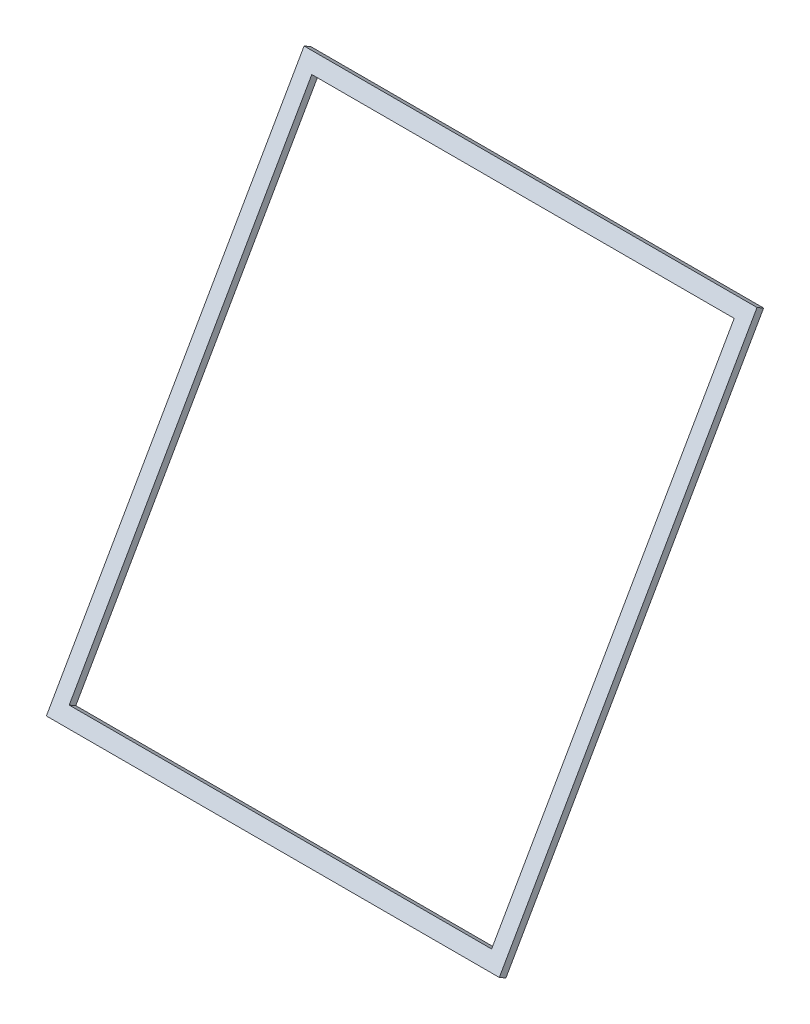
ISO-10303-21;
HEADER;
FILE_DESCRIPTION(('STEP AP214'),'2;1');
FILE_NAME('part.step','',(''),(''),'','','');
FILE_SCHEMA(('AUTOMOTIVE_DESIGN { 1 0 10303 214 1 1 1 1 }'));
ENDSEC;
DATA;
#1=APPLICATION_CONTEXT('core data for automotive mechanical design processes');
#2=APPLICATION_PROTOCOL_DEFINITION('international standard','automotive_design',2000,#1);
#3=PRODUCT_CONTEXT('',#1,'mechanical');
#4=PRODUCT('Part','Part','',(#3));
#5=PRODUCT_RELATED_PRODUCT_CATEGORY('part','',(#4));
#6=PRODUCT_DEFINITION_FORMATION('','',#4);
#7=PRODUCT_DEFINITION_CONTEXT('part definition',#1,'design');
#8=PRODUCT_DEFINITION('design','',#6,#7);
#9=PRODUCT_DEFINITION_SHAPE('','',#8);
#10=(LENGTH_UNIT() NAMED_UNIT(*) SI_UNIT(.MILLI.,.METRE.));
#11=(NAMED_UNIT(*) PLANE_ANGLE_UNIT() SI_UNIT($,.RADIAN.));
#12=(NAMED_UNIT(*) SI_UNIT($,.STERADIAN.) SOLID_ANGLE_UNIT());
#13=UNCERTAINTY_MEASURE_WITH_UNIT(LENGTH_MEASURE(1.E-05),#10,'distance_accuracy_value','');
#14=(GEOMETRIC_REPRESENTATION_CONTEXT(3) GLOBAL_UNCERTAINTY_ASSIGNED_CONTEXT((#13)) GLOBAL_UNIT_ASSIGNED_CONTEXT((#10,
#11,#12)) REPRESENTATION_CONTEXT('',''));
#15=CARTESIAN_POINT('',(0.,0.,0.));
#16=DIRECTION('',(0.,0.,1.));
#17=DIRECTION('',(1.,0.,0.));
#18=AXIS2_PLACEMENT_3D('',#15,#16,#17);
#19=CARTESIAN_POINT('',(-156.14773579459,169.506004766564,-4.48662909261624));
#20=DIRECTION('',(-1.,0.,0.));
#21=DIRECTION('',(0.,0.,1.));
#22=AXIS2_PLACEMENT_3D('',#19,#20,#21);
#23=PLANE('',#22);
#24=DIRECTION('',(0.,0.86839799800278,-0.495867842337819));
#25=VECTOR('',#24,1.);
#26=CARTESIAN_POINT('',(-156.14773579459,167.026665554875,-8.82861908263014));
#27=LINE('',#26,#25);
#28=CARTESIAN_POINT('',(-156.14773579459,-128.723747925064,160.049153252291));
#29=VERTEX_POINT('',#28);
#30=CARTESIAN_POINT('',(-156.14773579459,167.026665554875,-8.82861908263014));
#31=VERTEX_POINT('',#30);
#32=EDGE_CURVE('E148',#29,#31,#27,.T.);
#33=ORIENTED_EDGE('',*,*,#32,.F.);
#34=DIRECTION('',(0.,-0.495867842337819,-0.86839799800278));
#35=VECTOR('',#34,1.);
#36=CARTESIAN_POINT('',(-156.14773579459,-126.244408713375,164.391143242305));
#37=LINE('',#36,#35);
#38=CARTESIAN_POINT('',(-156.14773579459,-126.244408713375,164.391143242305));
#39=VERTEX_POINT('',#38);
#40=EDGE_CURVE('E11',#39,#29,#37,.T.);
#41=ORIENTED_EDGE('',*,*,#40,.F.);
#42=DIRECTION('',(0.,0.86839799800278,-0.495867842337819));
#43=VECTOR('',#42,1.);
#44=CARTESIAN_POINT('',(-156.14773579459,169.506004766564,-4.48662909261624));
#45=LINE('',#44,#43);
#46=CARTESIAN_POINT('',(-156.14773579459,169.506004766564,-4.48662909261624));
#47=VERTEX_POINT('',#46);
#48=EDGE_CURVE('E154',#39,#47,#45,.T.);
#49=ORIENTED_EDGE('',*,*,#48,.T.);
#50=DIRECTION('',(0.,-0.495867842337819,-0.86839799800278));
#51=VECTOR('',#50,1.);
#52=CARTESIAN_POINT('',(-156.14773579459,169.506004766564,-4.48662909261624));
#53=LINE('',#52,#51);
#54=EDGE_CURVE('E42',#47,#31,#53,.T.);
#55=ORIENTED_EDGE('',*,*,#54,.T.);
#56=EDGE_LOOP('',(#33,#41,#49,#55));
#57=FACE_BOUND('',#56,.T.);
#58=ADVANCED_FACE('F39',(#57),#23,.T.);
#59=CARTESIAN_POINT('',(140.639549827685,-126.244408713375,164.391143242305));
#60=DIRECTION('',(0.,-0.86839799800278,0.495867842337819));
#61=DIRECTION('',(0.,-0.495867842337819,-0.86839799800278));
#62=AXIS2_PLACEMENT_3D('',#59,#60,#61);
#63=PLANE('',#62);
#64=DIRECTION('',(-1.,0.,0.));
#65=VECTOR('',#64,1.);
#66=CARTESIAN_POINT('',(140.639549827685,-128.723747925064,160.049153252291));
#67=LINE('',#66,#65);
#68=CARTESIAN_POINT('',(140.639549827685,-128.723747925064,160.049153252291));
#69=VERTEX_POINT('',#68);
#70=EDGE_CURVE('E159',#69,#29,#67,.T.);
#71=ORIENTED_EDGE('',*,*,#70,.F.);
#72=DIRECTION('',(0.,-0.495867842337819,-0.86839799800278));
#73=VECTOR('',#72,1.);
#74=CARTESIAN_POINT('',(140.639549827685,-126.244408713375,164.391143242305));
#75=LINE('',#74,#73);
#76=CARTESIAN_POINT('',(140.639549827685,-126.244408713375,164.391143242305));
#77=VERTEX_POINT('',#76);
#78=EDGE_CURVE('E48',#77,#69,#75,.T.);
#79=ORIENTED_EDGE('',*,*,#78,.F.);
#80=DIRECTION('',(-1.,0.,0.));
#81=VECTOR('',#80,1.);
#82=CARTESIAN_POINT('',(140.639549827685,-126.244408713375,164.391143242305));
#83=LINE('',#82,#81);
#84=EDGE_CURVE('E167',#77,#39,#83,.T.);
#85=ORIENTED_EDGE('',*,*,#84,.T.);
#86=ORIENTED_EDGE('',*,*,#40,.T.);
#87=EDGE_LOOP('',(#71,#79,#85,#86));
#88=FACE_BOUND('',#87,.T.);
#89=ADVANCED_FACE('F201',(#88),#63,.T.);
#90=CARTESIAN_POINT('',(140.639549827685,169.506004766564,-4.48662909261624));
#91=DIRECTION('',(1.,0.,0.));
#92=DIRECTION('',(0.,0.,-1.));
#93=AXIS2_PLACEMENT_3D('',#90,#91,#92);
#94=PLANE('',#93);
#95=DIRECTION('',(0.,-0.86839799800278,0.495867842337819));
#96=VECTOR('',#95,1.);
#97=CARTESIAN_POINT('',(140.639549827685,167.026665554875,-8.82861908263014));
#98=LINE('',#97,#96);
#99=CARTESIAN_POINT('',(140.639549827685,167.026665554875,-8.82861908263014));
#100=VERTEX_POINT('',#99);
#101=EDGE_CURVE('E178',#100,#69,#98,.T.);
#102=ORIENTED_EDGE('',*,*,#101,.F.);
#103=DIRECTION('',(0.,-0.495867842337819,-0.86839799800278));
#104=VECTOR('',#103,1.);
#105=CARTESIAN_POINT('',(140.639549827685,169.506004766564,-4.48662909261624));
#106=LINE('',#105,#104);
#107=CARTESIAN_POINT('',(140.639549827685,169.506004766564,-4.48662909261624));
#108=VERTEX_POINT('',#107);
#109=EDGE_CURVE('E186',#108,#100,#106,.T.);
#110=ORIENTED_EDGE('',*,*,#109,.F.);
#111=DIRECTION('',(0.,-0.86839799800278,0.495867842337819));
#112=VECTOR('',#111,1.);
#113=CARTESIAN_POINT('',(140.639549827685,169.506004766564,-4.48662909261624));
#114=LINE('',#113,#112);
#115=EDGE_CURVE('E163',#108,#77,#114,.T.);
#116=ORIENTED_EDGE('',*,*,#115,.T.);
#117=ORIENTED_EDGE('',*,*,#78,.T.);
#118=EDGE_LOOP('',(#102,#110,#116,#117));
#119=FACE_BOUND('',#118,.T.);
#120=ADVANCED_FACE('F205',(#119),#94,.T.);
#121=CARTESIAN_POINT('',(140.639549827685,169.506004766564,-4.48662909261624));
#122=DIRECTION('',(0.,0.86839799800278,-0.495867842337819));
#123=DIRECTION('',(0.,0.495867842337819,0.86839799800278));
#124=AXIS2_PLACEMENT_3D('',#121,#122,#123);
#125=PLANE('',#124);
#126=DIRECTION('',(1.,0.,0.));
#127=VECTOR('',#126,1.);
#128=CARTESIAN_POINT('',(140.639549827685,167.026665554875,-8.82861908263014));
#129=LINE('',#128,#127);
#130=EDGE_CURVE('E174',#31,#100,#129,.T.);
#131=ORIENTED_EDGE('',*,*,#130,.F.);
#132=ORIENTED_EDGE('',*,*,#54,.F.);
#133=DIRECTION('',(1.,0.,0.));
#134=VECTOR('',#133,1.);
#135=CARTESIAN_POINT('',(140.639549827685,169.506004766564,-4.48662909261624));
#136=LINE('',#135,#134);
#137=EDGE_CURVE('E158',#47,#108,#136,.T.);
#138=ORIENTED_EDGE('',*,*,#137,.T.);
#139=ORIENTED_EDGE('',*,*,#109,.T.);
#140=EDGE_LOOP('',(#131,#132,#138,#139));
#141=FACE_BOUND('',#140,.T.);
#142=ADVANCED_FACE('F196',(#141),#125,.T.);
#143=CARTESIAN_POINT('',(0.,39.7469796919924,69.607654790545));
#144=DIRECTION('',(0.,-0.495867842337819,-0.86839799800278));
#145=DIRECTION('',(0.,0.86839799800278,-0.495867842337819));
#146=AXIS2_PLACEMENT_3D('',#143,#144,#145);
#147=PLANE('',#146);
#148=DIRECTION('',(1.,0.,0.));
#149=VECTOR('',#148,1.);
#150=CARTESIAN_POINT('',(130.639549827685,160.822024786536,0.472049330761952));
#151=LINE('',#150,#149);
#152=CARTESIAN_POINT('',(-146.14773579459,160.822024786536,0.472049330761952));
#153=VERTEX_POINT('',#152);
#154=CARTESIAN_POINT('',(130.639549827685,160.822024786536,0.472049330761952));
#155=VERTEX_POINT('',#154);
#156=EDGE_CURVE('E114',#153,#155,#151,.T.);
#157=ORIENTED_EDGE('',*,*,#156,.T.);
#158=DIRECTION('',(0.,-0.86839799800278,0.495867842337819));
#159=VECTOR('',#158,1.);
#160=CARTESIAN_POINT('',(130.639549827685,160.822024786536,0.472049330761952));
#161=LINE('',#160,#159);
#162=CARTESIAN_POINT('',(130.639549827685,-117.560428733347,159.432464818927));
#163=VERTEX_POINT('',#162);
#164=EDGE_CURVE('E107',#155,#163,#161,.T.);
#165=ORIENTED_EDGE('',*,*,#164,.T.);
#166=DIRECTION('',(-1.,0.,0.));
#167=VECTOR('',#166,1.);
#168=CARTESIAN_POINT('',(130.639549827685,-117.560428733347,159.432464818927));
#169=LINE('',#168,#167);
#170=CARTESIAN_POINT('',(-146.14773579459,-117.560428733347,159.432464818927));
#171=VERTEX_POINT('',#170);
#172=EDGE_CURVE('E117',#163,#171,#169,.T.);
#173=ORIENTED_EDGE('',*,*,#172,.T.);
#174=DIRECTION('',(0.,0.86839799800278,-0.495867842337819));
#175=VECTOR('',#174,1.);
#176=CARTESIAN_POINT('',(-146.14773579459,160.822024786536,0.472049330761952));
#177=LINE('',#176,#175);
#178=EDGE_CURVE('E56',#171,#153,#177,.T.);
#179=ORIENTED_EDGE('',*,*,#178,.T.);
#180=EDGE_LOOP('',(#157,#165,#173,#179));
#181=FACE_BOUND('',#180,.T.);
#182=ORIENTED_EDGE('',*,*,#48,.F.);
#183=ORIENTED_EDGE('',*,*,#84,.F.);
#184=ORIENTED_EDGE('',*,*,#115,.F.);
#185=ORIENTED_EDGE('',*,*,#137,.F.);
#186=EDGE_LOOP('',(#182,#183,#184,#185));
#187=FACE_BOUND('',#186,.T.);
#188=ADVANCED_FACE('F122',(#181,#187),#147,.F.);
#189=CARTESIAN_POINT('',(0.,37.2676404803033,65.2656648005311));
#190=DIRECTION('',(0.,-0.495867842337819,-0.86839799800278));
#191=DIRECTION('',(0.,0.86839799800278,-0.495867842337819));
#192=AXIS2_PLACEMENT_3D('',#189,#190,#191);
#193=PLANE('',#192);
#194=DIRECTION('',(0.,-0.86839799800278,0.495867842337819));
#195=VECTOR('',#194,1.);
#196=CARTESIAN_POINT('',(130.639549827685,158.342685574847,-3.86994065925195));
#197=LINE('',#196,#195);
#198=CARTESIAN_POINT('',(130.639549827685,158.342685574847,-3.86994065925195));
#199=VERTEX_POINT('',#198);
#200=CARTESIAN_POINT('',(130.639549827685,-120.039767945036,155.090474828913));
#201=VERTEX_POINT('',#200);
#202=EDGE_CURVE('E64',#199,#201,#197,.T.);
#203=ORIENTED_EDGE('',*,*,#202,.F.);
#204=DIRECTION('',(1.,0.,0.));
#205=VECTOR('',#204,1.);
#206=CARTESIAN_POINT('',(130.639549827685,158.342685574847,-3.86994065925195));
#207=LINE('',#206,#205);
#208=CARTESIAN_POINT('',(-146.14773579459,158.342685574847,-3.86994065925195));
#209=VERTEX_POINT('',#208);
#210=EDGE_CURVE('E126',#209,#199,#207,.T.);
#211=ORIENTED_EDGE('',*,*,#210,.F.);
#212=DIRECTION('',(0.,0.86839799800278,-0.495867842337819));
#213=VECTOR('',#212,1.);
#214=CARTESIAN_POINT('',(-146.14773579459,158.342685574847,-3.86994065925195));
#215=LINE('',#214,#213);
#216=CARTESIAN_POINT('',(-146.14773579459,-120.039767945036,155.090474828913));
#217=VERTEX_POINT('',#216);
#218=EDGE_CURVE('E130',#217,#209,#215,.T.);
#219=ORIENTED_EDGE('',*,*,#218,.F.);
#220=DIRECTION('',(-1.,0.,0.));
#221=VECTOR('',#220,1.);
#222=CARTESIAN_POINT('',(130.639549827685,-120.039767945036,155.090474828913));
#223=LINE('',#222,#221);
#224=EDGE_CURVE('E139',#201,#217,#223,.T.);
#225=ORIENTED_EDGE('',*,*,#224,.F.);
#226=EDGE_LOOP('',(#203,#211,#219,#225));
#227=FACE_BOUND('',#226,.T.);
#228=ORIENTED_EDGE('',*,*,#32,.T.);
#229=ORIENTED_EDGE('',*,*,#130,.T.);
#230=ORIENTED_EDGE('',*,*,#101,.T.);
#231=ORIENTED_EDGE('',*,*,#70,.T.);
#232=EDGE_LOOP('',(#228,#229,#230,#231));
#233=FACE_BOUND('',#232,.T.);
#234=ADVANCED_FACE('F198',(#227,#233),#193,.T.);
#235=CARTESIAN_POINT('',(130.639549827685,160.822024786536,0.472049330761952));
#236=DIRECTION('',(1.,0.,0.));
#237=DIRECTION('',(0.,0.,-1.));
#238=AXIS2_PLACEMENT_3D('',#235,#236,#237);
#239=PLANE('',#238);
#240=ORIENTED_EDGE('',*,*,#202,.T.);
#241=DIRECTION('',(0.,-0.495867842337819,-0.86839799800278));
#242=VECTOR('',#241,1.);
#243=CARTESIAN_POINT('',(130.639549827685,-117.560428733347,159.432464818927));
#244=LINE('',#243,#242);
#245=EDGE_CURVE('E103',#163,#201,#244,.T.);
#246=ORIENTED_EDGE('',*,*,#245,.F.);
#247=ORIENTED_EDGE('',*,*,#164,.F.);
#248=DIRECTION('',(0.,-0.495867842337819,-0.86839799800278));
#249=VECTOR('',#248,1.);
#250=CARTESIAN_POINT('',(130.639549827685,160.822024786536,0.472049330761952));
#251=LINE('',#250,#249);
#252=EDGE_CURVE('E145',#155,#199,#251,.T.);
#253=ORIENTED_EDGE('',*,*,#252,.T.);
#254=EDGE_LOOP('',(#240,#246,#247,#253));
#255=FACE_BOUND('',#254,.T.);
#256=ADVANCED_FACE('F105',(#255),#239,.F.);
#257=CARTESIAN_POINT('',(130.639549827685,160.822024786536,0.472049330761952));
#258=DIRECTION('',(0.,0.86839799800278,-0.495867842337819));
#259=DIRECTION('',(0.,0.495867842337819,0.86839799800278));
#260=AXIS2_PLACEMENT_3D('',#257,#258,#259);
#261=PLANE('',#260);
#262=ORIENTED_EDGE('',*,*,#210,.T.);
#263=ORIENTED_EDGE('',*,*,#252,.F.);
#264=ORIENTED_EDGE('',*,*,#156,.F.);
#265=DIRECTION('',(0.,-0.495867842337819,-0.86839799800278));
#266=VECTOR('',#265,1.);
#267=CARTESIAN_POINT('',(-146.14773579459,160.822024786536,0.472049330761952));
#268=LINE('',#267,#266);
#269=EDGE_CURVE('E149',#153,#209,#268,.T.);
#270=ORIENTED_EDGE('',*,*,#269,.T.);
#271=EDGE_LOOP('',(#262,#263,#264,#270));
#272=FACE_BOUND('',#271,.T.);
#273=ADVANCED_FACE('F256',(#272),#261,.F.);
#274=CARTESIAN_POINT('',(-146.14773579459,160.822024786536,0.472049330761952));
#275=DIRECTION('',(-1.,0.,0.));
#276=DIRECTION('',(0.,0.,1.));
#277=AXIS2_PLACEMENT_3D('',#274,#275,#276);
#278=PLANE('',#277);
#279=ORIENTED_EDGE('',*,*,#218,.T.);
#280=ORIENTED_EDGE('',*,*,#269,.F.);
#281=ORIENTED_EDGE('',*,*,#178,.F.);
#282=DIRECTION('',(0.,-0.495867842337819,-0.86839799800278));
#283=VECTOR('',#282,1.);
#284=CARTESIAN_POINT('',(-146.14773579459,-117.560428733347,159.432464818927));
#285=LINE('',#284,#283);
#286=EDGE_CURVE('E113',#171,#217,#285,.T.);
#287=ORIENTED_EDGE('',*,*,#286,.T.);
#288=EDGE_LOOP('',(#279,#280,#281,#287));
#289=FACE_BOUND('',#288,.T.);
#290=ADVANCED_FACE('F265',(#289),#278,.F.);
#291=CARTESIAN_POINT('',(130.639549827685,-117.560428733347,159.432464818927));
#292=DIRECTION('',(0.,-0.86839799800278,0.495867842337819));
#293=DIRECTION('',(0.,-0.495867842337819,-0.86839799800278));
#294=AXIS2_PLACEMENT_3D('',#291,#292,#293);
#295=PLANE('',#294);
#296=ORIENTED_EDGE('',*,*,#224,.T.);
#297=ORIENTED_EDGE('',*,*,#286,.F.);
#298=ORIENTED_EDGE('',*,*,#172,.F.);
#299=ORIENTED_EDGE('',*,*,#245,.T.);
#300=EDGE_LOOP('',(#296,#297,#298,#299));
#301=FACE_BOUND('',#300,.T.);
#302=ADVANCED_FACE('F118',(#301),#295,.F.);
#303=CLOSED_SHELL('',(#58,#89,#120,#142,#188,#234,#256,#273,#290,#302));
#304=MANIFOLD_SOLID_BREP('B2',#303);
#305=ADVANCED_BREP_SHAPE_REPRESENTATION('',(#18,#304),#14);
#306=SHAPE_DEFINITION_REPRESENTATION(#9,#305);
ENDSEC;
END-ISO-10303-21;
